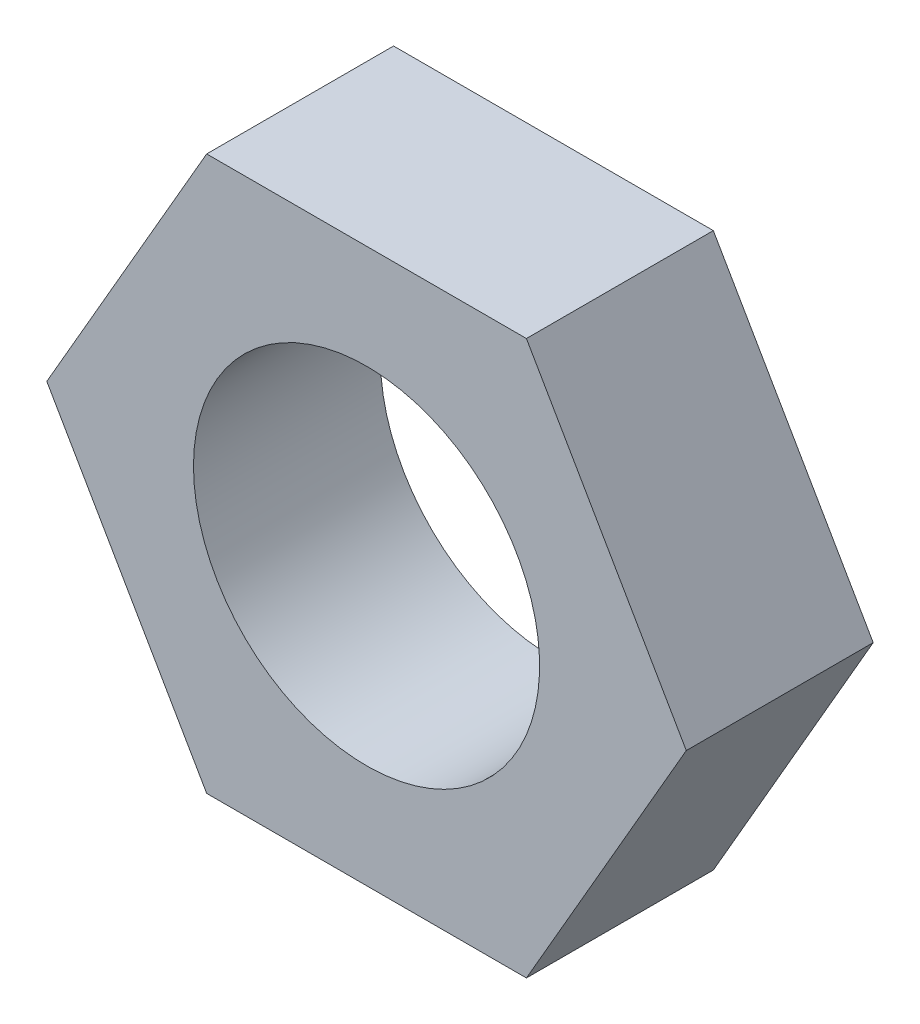
ISO-10303-21;
HEADER;
FILE_DESCRIPTION(('STEP AP214'),'2;1');
FILE_NAME('part.step','',(''),(''),'','','');
FILE_SCHEMA(('AUTOMOTIVE_DESIGN { 1 0 10303 214 1 1 1 1 }'));
ENDSEC;
DATA;
#1=APPLICATION_CONTEXT('core data for automotive mechanical design processes');
#2=APPLICATION_PROTOCOL_DEFINITION('international standard','automotive_design',2000,#1);
#3=PRODUCT_CONTEXT('',#1,'mechanical');
#4=PRODUCT('Part','Part','',(#3));
#5=PRODUCT_RELATED_PRODUCT_CATEGORY('part','',(#4));
#6=PRODUCT_DEFINITION_FORMATION('','',#4);
#7=PRODUCT_DEFINITION_CONTEXT('part definition',#1,'design');
#8=PRODUCT_DEFINITION('design','',#6,#7);
#9=PRODUCT_DEFINITION_SHAPE('','',#8);
#10=(LENGTH_UNIT() NAMED_UNIT(*) SI_UNIT(.MILLI.,.METRE.));
#11=(NAMED_UNIT(*) PLANE_ANGLE_UNIT() SI_UNIT($,.RADIAN.));
#12=(NAMED_UNIT(*) SI_UNIT($,.STERADIAN.) SOLID_ANGLE_UNIT());
#13=UNCERTAINTY_MEASURE_WITH_UNIT(LENGTH_MEASURE(1.E-05),#10,'distance_accuracy_value','');
#14=(GEOMETRIC_REPRESENTATION_CONTEXT(3) GLOBAL_UNCERTAINTY_ASSIGNED_CONTEXT((#13)) GLOBAL_UNIT_ASSIGNED_CONTEXT((#10,
#11,#12)) REPRESENTATION_CONTEXT('',''));
#15=CARTESIAN_POINT('',(0.,0.,0.));
#16=DIRECTION('',(0.,0.,1.));
#17=DIRECTION('',(1.,0.,0.));
#18=AXIS2_PLACEMENT_3D('',#15,#16,#17);
#19=CARTESIAN_POINT('',(2.3094010767585,4.,0.));
#20=DIRECTION('',(0.,1.,0.));
#21=DIRECTION('',(0.,0.,1.));
#22=AXIS2_PLACEMENT_3D('',#19,#20,#21);
#23=PLANE('',#22);
#24=DIRECTION('',(-1.,0.,0.));
#25=VECTOR('',#24,1.);
#26=CARTESIAN_POINT('',(2.3094010767585,4.,2.7));
#27=LINE('',#26,#25);
#28=CARTESIAN_POINT('',(2.3094010767585,4.,2.7));
#29=VERTEX_POINT('',#28);
#30=CARTESIAN_POINT('',(-2.3094010767585,4.,2.7));
#31=VERTEX_POINT('',#30);
#32=EDGE_CURVE('E117',#29,#31,#27,.T.);
#33=ORIENTED_EDGE('',*,*,#32,.F.);
#34=DIRECTION('',(0.,0.,1.));
#35=VECTOR('',#34,1.);
#36=CARTESIAN_POINT('',(2.3094010767585,4.,0.));
#37=LINE('',#36,#35);
#38=CARTESIAN_POINT('',(2.3094010767585,4.,0.));
#39=VERTEX_POINT('',#38);
#40=EDGE_CURVE('E11',#39,#29,#37,.T.);
#41=ORIENTED_EDGE('',*,*,#40,.F.);
#42=DIRECTION('',(-1.,0.,0.));
#43=VECTOR('',#42,1.);
#44=CARTESIAN_POINT('',(2.3094010767585,4.,0.));
#45=LINE('',#44,#43);
#46=CARTESIAN_POINT('',(-2.3094010767585,4.,0.));
#47=VERTEX_POINT('',#46);
#48=EDGE_CURVE('E132',#39,#47,#45,.T.);
#49=ORIENTED_EDGE('',*,*,#48,.T.);
#50=DIRECTION('',(0.,0.,1.));
#51=VECTOR('',#50,1.);
#52=CARTESIAN_POINT('',(-2.3094010767585,4.,0.));
#53=LINE('',#52,#51);
#54=EDGE_CURVE('E35',#47,#31,#53,.T.);
#55=ORIENTED_EDGE('',*,*,#54,.T.);
#56=EDGE_LOOP('',(#33,#41,#49,#55));
#57=FACE_BOUND('',#56,.T.);
#58=ADVANCED_FACE('F32',(#57),#23,.T.);
#59=CARTESIAN_POINT('',(4.618802153517,0.,0.));
#60=DIRECTION('',(0.866025403784438,0.5,0.));
#61=DIRECTION('',(-0.5,0.866025403784438,0.));
#62=AXIS2_PLACEMENT_3D('',#59,#60,#61);
#63=PLANE('',#62);
#64=DIRECTION('',(-0.5,0.866025403784438,0.));
#65=VECTOR('',#64,1.);
#66=CARTESIAN_POINT('',(4.618802153517,0.,2.7));
#67=LINE('',#66,#65);
#68=CARTESIAN_POINT('',(4.618802153517,0.,2.7));
#69=VERTEX_POINT('',#68);
#70=EDGE_CURVE('E130',#69,#29,#67,.T.);
#71=ORIENTED_EDGE('',*,*,#70,.F.);
#72=DIRECTION('',(0.,0.,1.));
#73=VECTOR('',#72,1.);
#74=CARTESIAN_POINT('',(4.618802153517,0.,0.));
#75=LINE('',#74,#73);
#76=CARTESIAN_POINT('',(4.618802153517,0.,0.));
#77=VERTEX_POINT('',#76);
#78=EDGE_CURVE('E41',#77,#69,#75,.T.);
#79=ORIENTED_EDGE('',*,*,#78,.F.);
#80=DIRECTION('',(-0.5,0.866025403784438,0.));
#81=VECTOR('',#80,1.);
#82=CARTESIAN_POINT('',(4.618802153517,0.,0.));
#83=LINE('',#82,#81);
#84=EDGE_CURVE('E107',#77,#39,#83,.T.);
#85=ORIENTED_EDGE('',*,*,#84,.T.);
#86=ORIENTED_EDGE('',*,*,#40,.T.);
#87=EDGE_LOOP('',(#71,#79,#85,#86));
#88=FACE_BOUND('',#87,.T.);
#89=ADVANCED_FACE('F140',(#88),#63,.T.);
#90=CARTESIAN_POINT('',(2.3094010767585,-4.,0.));
#91=DIRECTION('',(0.866025403784438,-0.5,0.));
#92=DIRECTION('',(0.5,0.866025403784439,0.));
#93=AXIS2_PLACEMENT_3D('',#90,#91,#92);
#94=PLANE('',#93);
#95=DIRECTION('',(0.5,0.866025403784439,0.));
#96=VECTOR('',#95,1.);
#97=CARTESIAN_POINT('',(2.3094010767585,-4.,2.7));
#98=LINE('',#97,#96);
#99=CARTESIAN_POINT('',(2.3094010767585,-4.,2.7));
#100=VERTEX_POINT('',#99);
#101=EDGE_CURVE('E94',#100,#69,#98,.T.);
#102=ORIENTED_EDGE('',*,*,#101,.F.);
#103=DIRECTION('',(0.,0.,1.));
#104=VECTOR('',#103,1.);
#105=CARTESIAN_POINT('',(2.3094010767585,-4.,0.));
#106=LINE('',#105,#104);
#107=CARTESIAN_POINT('',(2.3094010767585,-4.,0.));
#108=VERTEX_POINT('',#107);
#109=EDGE_CURVE('E89',#108,#100,#106,.T.);
#110=ORIENTED_EDGE('',*,*,#109,.F.);
#111=DIRECTION('',(0.5,0.866025403784439,0.));
#112=VECTOR('',#111,1.);
#113=CARTESIAN_POINT('',(2.3094010767585,-4.,0.));
#114=LINE('',#113,#112);
#115=EDGE_CURVE('E92',#108,#77,#114,.T.);
#116=ORIENTED_EDGE('',*,*,#115,.T.);
#117=ORIENTED_EDGE('',*,*,#78,.T.);
#118=EDGE_LOOP('',(#102,#110,#116,#117));
#119=FACE_BOUND('',#118,.T.);
#120=ADVANCED_FACE('F91',(#119),#94,.T.);
#121=CARTESIAN_POINT('',(-2.3094010767585,-4.,0.));
#122=DIRECTION('',(0.,-1.,0.));
#123=DIRECTION('',(1.,0.,0.));
#124=AXIS2_PLACEMENT_3D('',#121,#122,#123);
#125=PLANE('',#124);
#126=DIRECTION('',(1.,0.,0.));
#127=VECTOR('',#126,1.);
#128=CARTESIAN_POINT('',(-2.3094010767585,-4.,2.7));
#129=LINE('',#128,#127);
#130=CARTESIAN_POINT('',(-2.3094010767585,-4.,2.7));
#131=VERTEX_POINT('',#130);
#132=EDGE_CURVE('E127',#131,#100,#129,.T.);
#133=ORIENTED_EDGE('',*,*,#132,.F.);
#134=DIRECTION('',(0.,0.,1.));
#135=VECTOR('',#134,1.);
#136=CARTESIAN_POINT('',(-2.3094010767585,-4.,0.));
#137=LINE('',#136,#135);
#138=CARTESIAN_POINT('',(-2.3094010767585,-4.,0.));
#139=VERTEX_POINT('',#138);
#140=EDGE_CURVE('E99',#139,#131,#137,.T.);
#141=ORIENTED_EDGE('',*,*,#140,.F.);
#142=DIRECTION('',(1.,0.,0.));
#143=VECTOR('',#142,1.);
#144=CARTESIAN_POINT('',(-2.3094010767585,-4.,0.));
#145=LINE('',#144,#143);
#146=EDGE_CURVE('E105',#139,#108,#145,.T.);
#147=ORIENTED_EDGE('',*,*,#146,.T.);
#148=ORIENTED_EDGE('',*,*,#109,.T.);
#149=EDGE_LOOP('',(#133,#141,#147,#148));
#150=FACE_BOUND('',#149,.T.);
#151=ADVANCED_FACE('F109',(#150),#125,.T.);
#152=CARTESIAN_POINT('',(-4.61880215351701,0.,0.));
#153=DIRECTION('',(-0.866025403784438,-0.5,0.));
#154=DIRECTION('',(0.5,-0.866025403784438,0.));
#155=AXIS2_PLACEMENT_3D('',#152,#153,#154);
#156=PLANE('',#155);
#157=DIRECTION('',(0.5,-0.866025403784438,0.));
#158=VECTOR('',#157,1.);
#159=CARTESIAN_POINT('',(-4.61880215351701,0.,2.7));
#160=LINE('',#159,#158);
#161=CARTESIAN_POINT('',(-4.61880215351701,0.,2.7));
#162=VERTEX_POINT('',#161);
#163=EDGE_CURVE('E124',#162,#131,#160,.T.);
#164=ORIENTED_EDGE('',*,*,#163,.F.);
#165=DIRECTION('',(0.,0.,1.));
#166=VECTOR('',#165,1.);
#167=CARTESIAN_POINT('',(-4.61880215351701,0.,0.));
#168=LINE('',#167,#166);
#169=CARTESIAN_POINT('',(-4.61880215351701,0.,0.));
#170=VERTEX_POINT('',#169);
#171=EDGE_CURVE('E135',#170,#162,#168,.T.);
#172=ORIENTED_EDGE('',*,*,#171,.F.);
#173=DIRECTION('',(0.5,-0.866025403784438,0.));
#174=VECTOR('',#173,1.);
#175=CARTESIAN_POINT('',(-4.61880215351701,0.,0.));
#176=LINE('',#175,#174);
#177=EDGE_CURVE('E110',#170,#139,#176,.T.);
#178=ORIENTED_EDGE('',*,*,#177,.T.);
#179=ORIENTED_EDGE('',*,*,#140,.T.);
#180=EDGE_LOOP('',(#164,#172,#178,#179));
#181=FACE_BOUND('',#180,.T.);
#182=ADVANCED_FACE('F153',(#181),#156,.T.);
#183=CARTESIAN_POINT('',(-2.3094010767585,4.,0.));
#184=DIRECTION('',(-0.866025403784438,0.5,0.));
#185=DIRECTION('',(-0.5,-0.866025403784438,0.));
#186=AXIS2_PLACEMENT_3D('',#183,#184,#185);
#187=PLANE('',#186);
#188=DIRECTION('',(-0.5,-0.866025403784438,0.));
#189=VECTOR('',#188,1.);
#190=CARTESIAN_POINT('',(-2.3094010767585,4.,2.7));
#191=LINE('',#190,#189);
#192=EDGE_CURVE('E120',#31,#162,#191,.T.);
#193=ORIENTED_EDGE('',*,*,#192,.F.);
#194=ORIENTED_EDGE('',*,*,#54,.F.);
#195=DIRECTION('',(-0.5,-0.866025403784438,0.));
#196=VECTOR('',#195,1.);
#197=CARTESIAN_POINT('',(-2.3094010767585,4.,0.));
#198=LINE('',#197,#196);
#199=EDGE_CURVE('E112',#47,#170,#198,.T.);
#200=ORIENTED_EDGE('',*,*,#199,.T.);
#201=ORIENTED_EDGE('',*,*,#171,.T.);
#202=EDGE_LOOP('',(#193,#194,#200,#201));
#203=FACE_BOUND('',#202,.T.);
#204=ADVANCED_FACE('F137',(#203),#187,.T.);
#205=CARTESIAN_POINT('',(0.,0.,0.));
#206=DIRECTION('',(0.,0.,1.));
#207=DIRECTION('',(1.,0.,0.));
#208=AXIS2_PLACEMENT_3D('',#205,#206,#207);
#209=PLANE('',#208);
#210=CARTESIAN_POINT('',(0.,0.,0.));
#211=DIRECTION('',(0.,0.,1.));
#212=DIRECTION('',(-1.,0.,0.));
#213=AXIS2_PLACEMENT_3D('',#210,#211,#212);
#214=CIRCLE('',#213,2.5);
#215=CARTESIAN_POINT('',(-2.5,0.,0.));
#216=VERTEX_POINT('',#215);
#217=EDGE_CURVE('E121',#216,#216,#214,.T.);
#218=ORIENTED_EDGE('',*,*,#217,.T.);
#219=EDGE_LOOP('',(#218));
#220=FACE_BOUND('',#219,.T.);
#221=ORIENTED_EDGE('',*,*,#48,.F.);
#222=ORIENTED_EDGE('',*,*,#84,.F.);
#223=ORIENTED_EDGE('',*,*,#115,.F.);
#224=ORIENTED_EDGE('',*,*,#146,.F.);
#225=ORIENTED_EDGE('',*,*,#177,.F.);
#226=ORIENTED_EDGE('',*,*,#199,.F.);
#227=EDGE_LOOP('',(#221,#222,#223,#224,#225,#226));
#228=FACE_BOUND('',#227,.T.);
#229=ADVANCED_FACE('F103',(#220,#228),#209,.F.);
#230=CARTESIAN_POINT('',(0.,0.,2.7));
#231=DIRECTION('',(0.,0.,1.));
#232=DIRECTION('',(1.,0.,0.));
#233=AXIS2_PLACEMENT_3D('',#230,#231,#232);
#234=PLANE('',#233);
#235=CARTESIAN_POINT('',(0.,0.,2.7));
#236=DIRECTION('',(0.,0.,1.));
#237=DIRECTION('',(-1.,0.,0.));
#238=AXIS2_PLACEMENT_3D('',#235,#236,#237);
#239=CIRCLE('',#238,2.5);
#240=CARTESIAN_POINT('',(-2.5,0.,2.7));
#241=VERTEX_POINT('',#240);
#242=EDGE_CURVE('E176',#241,#241,#239,.T.);
#243=ORIENTED_EDGE('',*,*,#242,.F.);
#244=EDGE_LOOP('',(#243));
#245=FACE_BOUND('',#244,.T.);
#246=ORIENTED_EDGE('',*,*,#32,.T.);
#247=ORIENTED_EDGE('',*,*,#192,.T.);
#248=ORIENTED_EDGE('',*,*,#163,.T.);
#249=ORIENTED_EDGE('',*,*,#132,.T.);
#250=ORIENTED_EDGE('',*,*,#101,.T.);
#251=ORIENTED_EDGE('',*,*,#70,.T.);
#252=EDGE_LOOP('',(#246,#247,#248,#249,#250,#251));
#253=FACE_BOUND('',#252,.T.);
#254=ADVANCED_FACE('F139',(#245,#253),#234,.T.);
#255=CARTESIAN_POINT('',(0.,0.,0.));
#256=DIRECTION('',(0.,0.,1.));
#257=DIRECTION('',(1.,0.,0.));
#258=AXIS2_PLACEMENT_3D('',#255,#256,#257);
#259=CYLINDRICAL_SURFACE('',#258,2.5);
#260=ORIENTED_EDGE('',*,*,#217,.F.);
#261=EDGE_LOOP('',(#260));
#262=FACE_BOUND('',#261,.T.);
#263=ORIENTED_EDGE('',*,*,#242,.T.);
#264=EDGE_LOOP('',(#263));
#265=FACE_BOUND('',#264,.T.);
#266=ADVANCED_FACE('F164',(#262,#265),#259,.F.);
#267=CLOSED_SHELL('',(#58,#89,#120,#151,#182,#204,#229,#254,#266));
#268=MANIFOLD_SOLID_BREP('B2',#267);
#269=ADVANCED_BREP_SHAPE_REPRESENTATION('',(#18,#268),#14);
#270=SHAPE_DEFINITION_REPRESENTATION(#9,#269);
ENDSEC;
END-ISO-10303-21;
